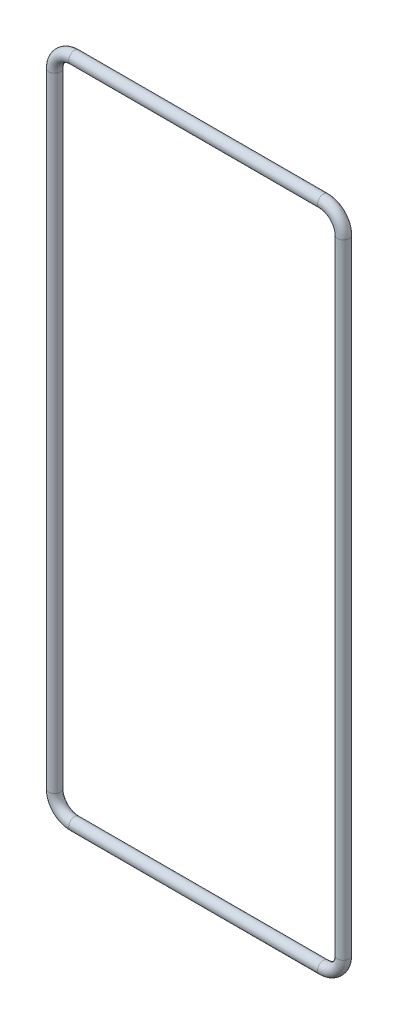
ISO-10303-21;
HEADER;
FILE_DESCRIPTION(('STEP AP214'),'2;1');
FILE_NAME('part.step','',(''),(''),'','','');
FILE_SCHEMA(('AUTOMOTIVE_DESIGN { 1 0 10303 214 1 1 1 1 }'));
ENDSEC;
DATA;
#1=APPLICATION_CONTEXT('core data for automotive mechanical design processes');
#2=APPLICATION_PROTOCOL_DEFINITION('international standard','automotive_design',2000,#1);
#3=PRODUCT_CONTEXT('',#1,'mechanical');
#4=PRODUCT('Part','Part','',(#3));
#5=PRODUCT_RELATED_PRODUCT_CATEGORY('part','',(#4));
#6=PRODUCT_DEFINITION_FORMATION('','',#4);
#7=PRODUCT_DEFINITION_CONTEXT('part definition',#1,'design');
#8=PRODUCT_DEFINITION('design','',#6,#7);
#9=PRODUCT_DEFINITION_SHAPE('','',#8);
#10=(LENGTH_UNIT() NAMED_UNIT(*) SI_UNIT(.MILLI.,.METRE.));
#11=(NAMED_UNIT(*) PLANE_ANGLE_UNIT() SI_UNIT($,.RADIAN.));
#12=(NAMED_UNIT(*) SI_UNIT($,.STERADIAN.) SOLID_ANGLE_UNIT());
#13=UNCERTAINTY_MEASURE_WITH_UNIT(LENGTH_MEASURE(1.E-05),#10,'distance_accuracy_value','');
#14=(GEOMETRIC_REPRESENTATION_CONTEXT(3) GLOBAL_UNCERTAINTY_ASSIGNED_CONTEXT((#13)) GLOBAL_UNIT_ASSIGNED_CONTEXT((#10,
#11,#12)) REPRESENTATION_CONTEXT('',''));
#15=CARTESIAN_POINT('',(0.,0.,0.));
#16=DIRECTION('',(0.,0.,1.));
#17=DIRECTION('',(1.,0.,0.));
#18=AXIS2_PLACEMENT_3D('',#15,#16,#17);
#19=CARTESIAN_POINT('',(37.5,94.,0.));
#20=DIRECTION('',(0.,0.,-1.));
#21=DIRECTION('',(-1.,0.,0.));
#22=AXIS2_PLACEMENT_3D('',#19,#20,#21);
#23=TOROIDAL_SURFACE('',#22,6.00000000000001,1.76500000000001);
#24=CARTESIAN_POINT('',(37.4999999999999,100.,0.));
#25=DIRECTION('',(-1.,0.,0.));
#26=DIRECTION('',(0.,0.,1.));
#27=AXIS2_PLACEMENT_3D('',#24,#25,#26);
#28=CIRCLE('',#27,1.76500000000001);
#29=CARTESIAN_POINT('',(37.4999999999999,101.765,0.));
#30=VERTEX_POINT('',#29);
#31=EDGE_CURVE('E37',#30,#30,#28,.T.);
#32=CARTESIAN_POINT('',(43.5,94.,0.));
#33=DIRECTION('',(0.,1.,0.));
#34=DIRECTION('',(0.,0.,1.));
#35=AXIS2_PLACEMENT_3D('',#32,#33,#34);
#36=CIRCLE('',#35,1.76500000000001);
#37=CARTESIAN_POINT('',(45.265,94.,0.));
#38=VERTEX_POINT('',#37);
#39=EDGE_CURVE('E10',#38,#38,#36,.T.);
#40=CARTESIAN_POINT('',(37.5,94.,0.));
#41=DIRECTION('',(0.,0.,-1.));
#42=DIRECTION('',(-1.,0.,0.));
#43=AXIS2_PLACEMENT_3D('',#40,#41,#42);
#44=CIRCLE('',#43,7.76500000000001);
#45=EDGE_CURVE('',#30,#38,#44,.T.);
#46=ORIENTED_EDGE('',*,*,#31,.F.);
#47=ORIENTED_EDGE('',*,*,#39,.T.);
#48=ORIENTED_EDGE('',*,*,#45,.T.);
#49=ORIENTED_EDGE('',*,*,#45,.F.);
#50=EDGE_LOOP('',(#46,#48,#47,#49));
#51=FACE_BOUND('',#50,.T.);
#52=ADVANCED_FACE('F31',(#51),#23,.T.);
#53=CARTESIAN_POINT('',(-37.5,100.,0.));
#54=DIRECTION('',(1.,0.,0.));
#55=DIRECTION('',(0.,0.,-1.));
#56=AXIS2_PLACEMENT_3D('',#53,#54,#55);
#57=CYLINDRICAL_SURFACE('',#56,1.76500000000001);
#58=CARTESIAN_POINT('',(-37.5,100.,0.));
#59=DIRECTION('',(-1.,0.,0.));
#60=DIRECTION('',(0.,0.,1.));
#61=AXIS2_PLACEMENT_3D('',#58,#59,#60);
#62=CIRCLE('',#61,1.76500000000001);
#63=CARTESIAN_POINT('',(-37.5,101.765,0.));
#64=VERTEX_POINT('',#63);
#65=EDGE_CURVE('E41',#64,#64,#62,.T.);
#66=ORIENTED_EDGE('',*,*,#65,.F.);
#67=EDGE_LOOP('',(#66));
#68=FACE_BOUND('',#67,.T.);
#69=ORIENTED_EDGE('',*,*,#31,.T.);
#70=EDGE_LOOP('',(#69));
#71=FACE_BOUND('',#70,.T.);
#72=ADVANCED_FACE('F93',(#68,#71),#57,.T.);
#73=CARTESIAN_POINT('',(-37.5,94.,0.));
#74=DIRECTION('',(0.,0.,-1.));
#75=DIRECTION('',(-1.,0.,0.));
#76=AXIS2_PLACEMENT_3D('',#73,#74,#75);
#77=TOROIDAL_SURFACE('',#76,6.00000000000001,1.76500000000001);
#78=CARTESIAN_POINT('',(-43.5,93.9999999999999,0.));
#79=DIRECTION('',(0.,-1.,0.));
#80=DIRECTION('',(0.,0.,1.));
#81=AXIS2_PLACEMENT_3D('',#78,#79,#80);
#82=CIRCLE('',#81,1.76500000000001);
#83=CARTESIAN_POINT('',(-45.265,93.9999999999999,0.));
#84=VERTEX_POINT('',#83);
#85=EDGE_CURVE('E45',#84,#84,#82,.T.);
#86=CARTESIAN_POINT('',(-37.5,94.,0.));
#87=DIRECTION('',(0.,0.,-1.));
#88=DIRECTION('',(-1.,0.,0.));
#89=AXIS2_PLACEMENT_3D('',#86,#87,#88);
#90=CIRCLE('',#89,7.76500000000001);
#91=EDGE_CURVE('',#84,#64,#90,.T.);
#92=ORIENTED_EDGE('',*,*,#85,.F.);
#93=ORIENTED_EDGE('',*,*,#65,.T.);
#94=ORIENTED_EDGE('',*,*,#91,.T.);
#95=ORIENTED_EDGE('',*,*,#91,.F.);
#96=EDGE_LOOP('',(#92,#94,#93,#95));
#97=FACE_BOUND('',#96,.T.);
#98=ADVANCED_FACE('F87',(#97),#77,.T.);
#99=CARTESIAN_POINT('',(-43.5,-94.,0.));
#100=DIRECTION('',(0.,1.,0.));
#101=DIRECTION('',(0.,0.,1.));
#102=AXIS2_PLACEMENT_3D('',#99,#100,#101);
#103=CYLINDRICAL_SURFACE('',#102,1.76500000000001);
#104=CARTESIAN_POINT('',(-43.5,-94.,0.));
#105=DIRECTION('',(0.,-1.,0.));
#106=DIRECTION('',(0.,0.,1.));
#107=AXIS2_PLACEMENT_3D('',#104,#105,#106);
#108=CIRCLE('',#107,1.76500000000001);
#109=CARTESIAN_POINT('',(-45.265,-94.,0.));
#110=VERTEX_POINT('',#109);
#111=EDGE_CURVE('E50',#110,#110,#108,.T.);
#112=ORIENTED_EDGE('',*,*,#111,.F.);
#113=EDGE_LOOP('',(#112));
#114=FACE_BOUND('',#113,.T.);
#115=ORIENTED_EDGE('',*,*,#85,.T.);
#116=EDGE_LOOP('',(#115));
#117=FACE_BOUND('',#116,.T.);
#118=ADVANCED_FACE('F81',(#114,#117),#103,.T.);
#119=CARTESIAN_POINT('',(-37.5,-94.,0.));
#120=DIRECTION('',(0.,0.,-1.));
#121=DIRECTION('',(-1.,0.,0.));
#122=AXIS2_PLACEMENT_3D('',#119,#120,#121);
#123=TOROIDAL_SURFACE('',#122,6.00000000000001,1.76500000000001);
#124=CARTESIAN_POINT('',(-37.5,-100.,0.));
#125=DIRECTION('',(1.,0.,0.));
#126=DIRECTION('',(0.,0.,1.));
#127=AXIS2_PLACEMENT_3D('',#124,#125,#126);
#128=CIRCLE('',#127,1.76500000000001);
#129=CARTESIAN_POINT('',(-37.5,-101.765,0.));
#130=VERTEX_POINT('',#129);
#131=EDGE_CURVE('E53',#130,#130,#128,.T.);
#132=CARTESIAN_POINT('',(-37.5,-94.,0.));
#133=DIRECTION('',(0.,0.,-1.));
#134=DIRECTION('',(-1.,0.,0.));
#135=AXIS2_PLACEMENT_3D('',#132,#133,#134);
#136=CIRCLE('',#135,7.76500000000001);
#137=EDGE_CURVE('',#130,#110,#136,.T.);
#138=ORIENTED_EDGE('',*,*,#131,.F.);
#139=ORIENTED_EDGE('',*,*,#111,.T.);
#140=ORIENTED_EDGE('',*,*,#137,.T.);
#141=ORIENTED_EDGE('',*,*,#137,.F.);
#142=EDGE_LOOP('',(#138,#140,#139,#141));
#143=FACE_BOUND('',#142,.T.);
#144=ADVANCED_FACE('F75',(#143),#123,.T.);
#145=CARTESIAN_POINT('',(37.4999999999999,-100.,0.));
#146=DIRECTION('',(-1.,0.,0.));
#147=DIRECTION('',(0.,0.,1.));
#148=AXIS2_PLACEMENT_3D('',#145,#146,#147);
#149=CYLINDRICAL_SURFACE('',#148,1.76500000000001);
#150=CARTESIAN_POINT('',(37.4999999999999,-100.,0.));
#151=DIRECTION('',(1.,0.,0.));
#152=DIRECTION('',(0.,0.,1.));
#153=AXIS2_PLACEMENT_3D('',#150,#151,#152);
#154=CIRCLE('',#153,1.76500000000001);
#155=CARTESIAN_POINT('',(37.4999999999999,-101.765,0.));
#156=VERTEX_POINT('',#155);
#157=EDGE_CURVE('E56',#156,#156,#154,.T.);
#158=ORIENTED_EDGE('',*,*,#157,.F.);
#159=EDGE_LOOP('',(#158));
#160=FACE_BOUND('',#159,.T.);
#161=ORIENTED_EDGE('',*,*,#131,.T.);
#162=EDGE_LOOP('',(#161));
#163=FACE_BOUND('',#162,.T.);
#164=ADVANCED_FACE('F69',(#160,#163),#149,.T.);
#165=CARTESIAN_POINT('',(37.5,-94.,0.));
#166=DIRECTION('',(0.,0.,-1.));
#167=DIRECTION('',(-1.,0.,0.));
#168=AXIS2_PLACEMENT_3D('',#165,#166,#167);
#169=TOROIDAL_SURFACE('',#168,6.00000000000001,1.76500000000001);
#170=CARTESIAN_POINT('',(43.5,-94.,0.));
#171=DIRECTION('',(0.,1.,0.));
#172=DIRECTION('',(0.,0.,1.));
#173=AXIS2_PLACEMENT_3D('',#170,#171,#172);
#174=CIRCLE('',#173,1.76500000000001);
#175=CARTESIAN_POINT('',(45.265,-93.9999999999999,0.));
#176=VERTEX_POINT('',#175);
#177=EDGE_CURVE('E59',#176,#176,#174,.T.);
#178=CARTESIAN_POINT('',(37.5,-94.,0.));
#179=DIRECTION('',(0.,0.,-1.));
#180=DIRECTION('',(-1.,0.,0.));
#181=AXIS2_PLACEMENT_3D('',#178,#179,#180);
#182=CIRCLE('',#181,7.76500000000001);
#183=EDGE_CURVE('',#176,#156,#182,.T.);
#184=ORIENTED_EDGE('',*,*,#177,.F.);
#185=ORIENTED_EDGE('',*,*,#157,.T.);
#186=ORIENTED_EDGE('',*,*,#183,.T.);
#187=ORIENTED_EDGE('',*,*,#183,.F.);
#188=EDGE_LOOP('',(#184,#186,#185,#187));
#189=FACE_BOUND('',#188,.T.);
#190=ADVANCED_FACE('F66',(#189),#169,.T.);
#191=CARTESIAN_POINT('',(43.5,-94.,0.));
#192=DIRECTION('',(0.,1.,0.));
#193=DIRECTION('',(0.,0.,1.));
#194=AXIS2_PLACEMENT_3D('',#191,#192,#193);
#195=CYLINDRICAL_SURFACE('',#194,1.76500000000001);
#196=ORIENTED_EDGE('',*,*,#177,.T.);
#197=EDGE_LOOP('',(#196));
#198=FACE_BOUND('',#197,.T.);
#199=ORIENTED_EDGE('',*,*,#39,.F.);
#200=EDGE_LOOP('',(#199));
#201=FACE_BOUND('',#200,.T.);
#202=ADVANCED_FACE('F63',(#198,#201),#195,.T.);
#203=CLOSED_SHELL('',(#52,#72,#98,#118,#144,#164,#190,#202));
#204=MANIFOLD_SOLID_BREP('B2',#203);
#205=ADVANCED_BREP_SHAPE_REPRESENTATION('',(#18,#204),#14);
#206=SHAPE_DEFINITION_REPRESENTATION(#9,#205);
ENDSEC;
END-ISO-10303-21;
